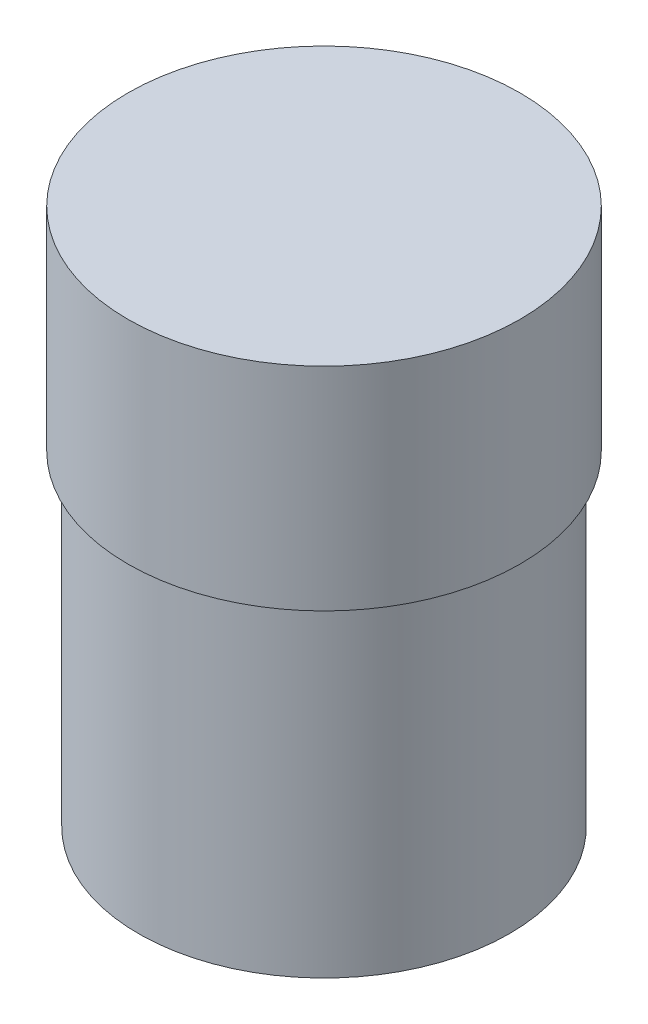
ISO-10303-21;
HEADER;
FILE_DESCRIPTION(('STEP AP214'),'2;1');
FILE_NAME('part.step','',(''),(''),'','','');
FILE_SCHEMA(('AUTOMOTIVE_DESIGN { 1 0 10303 214 1 1 1 1 }'));
ENDSEC;
DATA;
#1=APPLICATION_CONTEXT('core data for automotive mechanical design processes');
#2=APPLICATION_PROTOCOL_DEFINITION('international standard','automotive_design',2000,#1);
#3=PRODUCT_CONTEXT('',#1,'mechanical');
#4=PRODUCT('Part','Part','',(#3));
#5=PRODUCT_RELATED_PRODUCT_CATEGORY('part','',(#4));
#6=PRODUCT_DEFINITION_FORMATION('','',#4);
#7=PRODUCT_DEFINITION_CONTEXT('part definition',#1,'design');
#8=PRODUCT_DEFINITION('design','',#6,#7);
#9=PRODUCT_DEFINITION_SHAPE('','',#8);
#10=(LENGTH_UNIT() NAMED_UNIT(*) SI_UNIT(.MILLI.,.METRE.));
#11=(NAMED_UNIT(*) PLANE_ANGLE_UNIT() SI_UNIT($,.RADIAN.));
#12=(NAMED_UNIT(*) SI_UNIT($,.STERADIAN.) SOLID_ANGLE_UNIT());
#13=UNCERTAINTY_MEASURE_WITH_UNIT(LENGTH_MEASURE(1.E-05),#10,'distance_accuracy_value','');
#14=(GEOMETRIC_REPRESENTATION_CONTEXT(3) GLOBAL_UNCERTAINTY_ASSIGNED_CONTEXT((#13)) GLOBAL_UNIT_ASSIGNED_CONTEXT((#10,
#11,#12)) REPRESENTATION_CONTEXT('',''));
#15=CARTESIAN_POINT('',(0.,0.,0.));
#16=DIRECTION('',(0.,0.,1.));
#17=DIRECTION('',(1.,0.,0.));
#18=AXIS2_PLACEMENT_3D('',#15,#16,#17);
#19=CARTESIAN_POINT('',(0.,50.7,0.));
#20=DIRECTION('',(0.,-1.,0.));
#21=DIRECTION('',(1.,0.,0.));
#22=AXIS2_PLACEMENT_3D('',#19,#20,#21);
#23=PLANE('',#22);
#24=CARTESIAN_POINT('',(0.,50.7,0.));
#25=DIRECTION('',(0.,-1.,0.));
#26=DIRECTION('',(1.,0.,0.));
#27=AXIS2_PLACEMENT_3D('',#24,#25,#26);
#28=CIRCLE('',#27,18.5);
#29=CARTESIAN_POINT('',(18.5,50.7,0.));
#30=VERTEX_POINT('',#29);
#31=EDGE_CURVE('E10',#30,#30,#28,.T.);
#32=ORIENTED_EDGE('',*,*,#31,.F.);
#33=EDGE_LOOP('',(#32));
#34=FACE_BOUND('',#33,.T.);
#35=ADVANCED_FACE('F43',(#34),#23,.F.);
#36=CARTESIAN_POINT('',(0.,50.7,0.));
#37=DIRECTION('',(0.,-1.,0.));
#38=DIRECTION('',(1.,0.,0.));
#39=AXIS2_PLACEMENT_3D('',#36,#37,#38);
#40=CYLINDRICAL_SURFACE('',#39,18.5);
#41=CARTESIAN_POINT('',(0.,30.7,0.));
#42=DIRECTION('',(0.,-1.,0.));
#43=DIRECTION('',(1.,0.,0.));
#44=AXIS2_PLACEMENT_3D('',#41,#42,#43);
#45=CIRCLE('',#44,18.5);
#46=CARTESIAN_POINT('',(18.5,30.7,0.));
#47=VERTEX_POINT('',#46);
#48=EDGE_CURVE('E50',#47,#47,#45,.T.);
#49=ORIENTED_EDGE('',*,*,#48,.F.);
#50=EDGE_LOOP('',(#49));
#51=FACE_BOUND('',#50,.T.);
#52=ORIENTED_EDGE('',*,*,#31,.T.);
#53=EDGE_LOOP('',(#52));
#54=FACE_BOUND('',#53,.T.);
#55=ADVANCED_FACE('F77',(#51,#54),#40,.T.);
#56=CARTESIAN_POINT('',(-18.5,30.7,0.));
#57=DIRECTION('',(0.,1.,0.));
#58=DIRECTION('',(-1.,0.,0.));
#59=AXIS2_PLACEMENT_3D('',#56,#57,#58);
#60=PLANE('',#59);
#61=CARTESIAN_POINT('',(0.,30.7,0.));
#62=DIRECTION('',(0.,-1.,0.));
#63=DIRECTION('',(1.,0.,0.));
#64=AXIS2_PLACEMENT_3D('',#61,#62,#63);
#65=CIRCLE('',#64,17.5);
#66=CARTESIAN_POINT('',(17.5,30.7,0.));
#67=VERTEX_POINT('',#66);
#68=EDGE_CURVE('E55',#67,#67,#65,.T.);
#69=ORIENTED_EDGE('',*,*,#68,.F.);
#70=EDGE_LOOP('',(#69));
#71=FACE_BOUND('',#70,.T.);
#72=ORIENTED_EDGE('',*,*,#48,.T.);
#73=EDGE_LOOP('',(#72));
#74=FACE_BOUND('',#73,.T.);
#75=ADVANCED_FACE('F72',(#71,#74),#60,.F.);
#76=CARTESIAN_POINT('',(0.,50.7,0.));
#77=DIRECTION('',(0.,-1.,0.));
#78=DIRECTION('',(1.,0.,0.));
#79=AXIS2_PLACEMENT_3D('',#76,#77,#78);
#80=CYLINDRICAL_SURFACE('',#79,17.5);
#81=CARTESIAN_POINT('',(0.,0.,0.));
#82=DIRECTION('',(0.,-1.,0.));
#83=DIRECTION('',(1.,0.,0.));
#84=AXIS2_PLACEMENT_3D('',#81,#82,#83);
#85=CIRCLE('',#84,17.5);
#86=CARTESIAN_POINT('',(17.4999999999999,0.,0.));
#87=VERTEX_POINT('',#86);
#88=EDGE_CURVE('E60',#87,#87,#85,.T.);
#89=ORIENTED_EDGE('',*,*,#88,.F.);
#90=EDGE_LOOP('',(#89));
#91=FACE_BOUND('',#90,.T.);
#92=ORIENTED_EDGE('',*,*,#68,.T.);
#93=EDGE_LOOP('',(#92));
#94=FACE_BOUND('',#93,.T.);
#95=ADVANCED_FACE('F69',(#91,#94),#80,.T.);
#96=CARTESIAN_POINT('',(-17.5,0.,0.));
#97=DIRECTION('',(0.,1.,0.));
#98=DIRECTION('',(-1.,0.,0.));
#99=AXIS2_PLACEMENT_3D('',#96,#97,#98);
#100=PLANE('',#99);
#101=ORIENTED_EDGE('',*,*,#88,.T.);
#102=EDGE_LOOP('',(#101));
#103=FACE_BOUND('',#102,.T.);
#104=ADVANCED_FACE('F67',(#103),#100,.F.);
#105=CLOSED_SHELL('',(#35,#55,#75,#95,#104));
#106=MANIFOLD_SOLID_BREP('B2',#105);
#107=ADVANCED_BREP_SHAPE_REPRESENTATION('',(#18,#106),#14);
#108=SHAPE_DEFINITION_REPRESENTATION(#9,#107);
ENDSEC;
END-ISO-10303-21;
